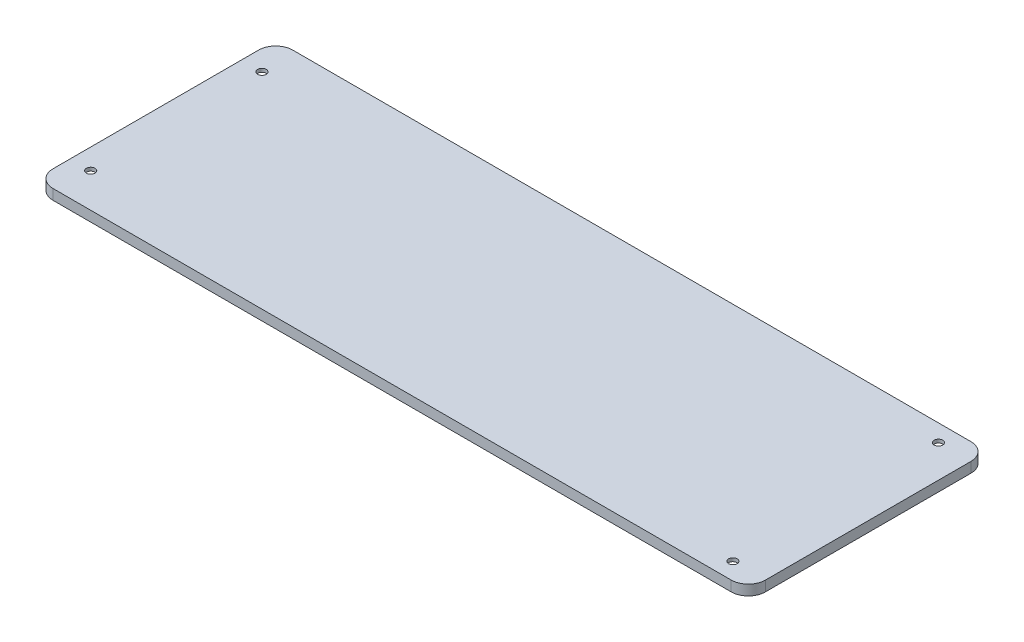
ISO-10303-21;
HEADER;
FILE_DESCRIPTION(('STEP AP214'),'2;1');
FILE_NAME('part.step','',(''),(''),'','','');
FILE_SCHEMA(('AUTOMOTIVE_DESIGN { 1 0 10303 214 1 1 1 1 }'));
ENDSEC;
DATA;
#1=APPLICATION_CONTEXT('core data for automotive mechanical design processes');
#2=APPLICATION_PROTOCOL_DEFINITION('international standard','automotive_design',2000,#1);
#3=PRODUCT_CONTEXT('',#1,'mechanical');
#4=PRODUCT('Part','Part','',(#3));
#5=PRODUCT_RELATED_PRODUCT_CATEGORY('part','',(#4));
#6=PRODUCT_DEFINITION_FORMATION('','',#4);
#7=PRODUCT_DEFINITION_CONTEXT('part definition',#1,'design');
#8=PRODUCT_DEFINITION('design','',#6,#7);
#9=PRODUCT_DEFINITION_SHAPE('','',#8);
#10=(LENGTH_UNIT() NAMED_UNIT(*) SI_UNIT(.MILLI.,.METRE.));
#11=(NAMED_UNIT(*) PLANE_ANGLE_UNIT() SI_UNIT($,.RADIAN.));
#12=(NAMED_UNIT(*) SI_UNIT($,.STERADIAN.) SOLID_ANGLE_UNIT());
#13=UNCERTAINTY_MEASURE_WITH_UNIT(LENGTH_MEASURE(1.E-05),#10,'distance_accuracy_value','');
#14=(GEOMETRIC_REPRESENTATION_CONTEXT(3) GLOBAL_UNCERTAINTY_ASSIGNED_CONTEXT((#13)) GLOBAL_UNIT_ASSIGNED_CONTEXT((#10,
#11,#12)) REPRESENTATION_CONTEXT('',''));
#15=CARTESIAN_POINT('',(0.,0.,0.));
#16=DIRECTION('',(0.,0.,1.));
#17=DIRECTION('',(1.,0.,0.));
#18=AXIS2_PLACEMENT_3D('',#15,#16,#17);
#19=CARTESIAN_POINT('',(0.,3.,0.));
#20=DIRECTION('',(0.,1.,0.));
#21=DIRECTION('',(0.,0.,1.));
#22=AXIS2_PLACEMENT_3D('',#19,#20,#21);
#23=PLANE('',#22);
#24=CARTESIAN_POINT('',(94.5,3.,-30.));
#25=DIRECTION('',(0.,1.,0.));
#26=DIRECTION('',(0.,0.,1.));
#27=AXIS2_PLACEMENT_3D('',#24,#25,#26);
#28=CIRCLE('',#27,1.25000000000001);
#29=CARTESIAN_POINT('',(94.5,3.,-28.75));
#30=VERTEX_POINT('',#29);
#31=EDGE_CURVE('E211',#30,#30,#28,.T.);
#32=ORIENTED_EDGE('',*,*,#31,.F.);
#33=EDGE_LOOP('',(#32));
#34=FACE_BOUND('',#33,.T.);
#35=CARTESIAN_POINT('',(-98.,3.,-25.));
#36=DIRECTION('',(0.,1.,0.));
#37=DIRECTION('',(0.,0.,1.));
#38=AXIS2_PLACEMENT_3D('',#35,#36,#37);
#39=CIRCLE('',#38,1.25000000000001);
#40=CARTESIAN_POINT('',(-98.,3.,-23.75));
#41=VERTEX_POINT('',#40);
#42=EDGE_CURVE('E138',#41,#41,#39,.T.);
#43=ORIENTED_EDGE('',*,*,#42,.F.);
#44=EDGE_LOOP('',(#43));
#45=FACE_BOUND('',#44,.T.);
#46=DIRECTION('',(1.,0.,0.));
#47=VECTOR('',#46,1.);
#48=CARTESIAN_POINT('',(-104.,3.,35.));
#49=LINE('',#48,#47);
#50=CARTESIAN_POINT('',(-99.,3.,35.));
#51=VERTEX_POINT('',#50);
#52=CARTESIAN_POINT('',(99.,3.,35.));
#53=VERTEX_POINT('',#52);
#54=EDGE_CURVE('E149',#51,#53,#49,.T.);
#55=ORIENTED_EDGE('',*,*,#54,.T.);
#56=CARTESIAN_POINT('',(99.,3.,30.));
#57=DIRECTION('',(0.,1.,0.));
#58=DIRECTION('',(0.,0.,1.));
#59=AXIS2_PLACEMENT_3D('',#56,#57,#58);
#60=CIRCLE('',#59,5.);
#61=CARTESIAN_POINT('',(104.,3.,30.));
#62=VERTEX_POINT('',#61);
#63=EDGE_CURVE('E179',#53,#62,#60,.T.);
#64=ORIENTED_EDGE('',*,*,#63,.T.);
#65=DIRECTION('',(0.,0.,-1.));
#66=VECTOR('',#65,1.);
#67=CARTESIAN_POINT('',(104.,3.,-35.));
#68=LINE('',#67,#66);
#69=CARTESIAN_POINT('',(104.,3.,-30.));
#70=VERTEX_POINT('',#69);
#71=EDGE_CURVE('E129',#62,#70,#68,.T.);
#72=ORIENTED_EDGE('',*,*,#71,.T.);
#73=CARTESIAN_POINT('',(99.,3.,-30.));
#74=DIRECTION('',(0.,1.,0.));
#75=DIRECTION('',(0.,0.,1.));
#76=AXIS2_PLACEMENT_3D('',#73,#74,#75);
#77=CIRCLE('',#76,5.);
#78=CARTESIAN_POINT('',(99.,3.,-35.));
#79=VERTEX_POINT('',#78);
#80=EDGE_CURVE('E176',#70,#79,#77,.T.);
#81=ORIENTED_EDGE('',*,*,#80,.T.);
#82=DIRECTION('',(-1.,0.,0.));
#83=VECTOR('',#82,1.);
#84=CARTESIAN_POINT('',(-104.,3.,-35.));
#85=LINE('',#84,#83);
#86=CARTESIAN_POINT('',(-99.,3.,-35.));
#87=VERTEX_POINT('',#86);
#88=EDGE_CURVE('E227',#79,#87,#85,.T.);
#89=ORIENTED_EDGE('',*,*,#88,.T.);
#90=CARTESIAN_POINT('',(-99.,3.,-30.));
#91=DIRECTION('',(0.,1.,0.));
#92=DIRECTION('',(0.,0.,1.));
#93=AXIS2_PLACEMENT_3D('',#90,#91,#92);
#94=CIRCLE('',#93,5.);
#95=CARTESIAN_POINT('',(-104.,3.,-30.));
#96=VERTEX_POINT('',#95);
#97=EDGE_CURVE('E63',#87,#96,#94,.T.);
#98=ORIENTED_EDGE('',*,*,#97,.T.);
#99=DIRECTION('',(0.,0.,1.));
#100=VECTOR('',#99,1.);
#101=CARTESIAN_POINT('',(-104.,3.,-35.));
#102=LINE('',#101,#100);
#103=CARTESIAN_POINT('',(-104.,3.,30.));
#104=VERTEX_POINT('',#103);
#105=EDGE_CURVE('E229',#96,#104,#102,.T.);
#106=ORIENTED_EDGE('',*,*,#105,.T.);
#107=CARTESIAN_POINT('',(-99.,3.,30.));
#108=DIRECTION('',(0.,1.,0.));
#109=DIRECTION('',(0.,0.,1.));
#110=AXIS2_PLACEMENT_3D('',#107,#108,#109);
#111=CIRCLE('',#110,5.);
#112=EDGE_CURVE('E171',#104,#51,#111,.T.);
#113=ORIENTED_EDGE('',*,*,#112,.T.);
#114=EDGE_LOOP('',(#55,#64,#72,#81,#89,#98,#106,#113));
#115=FACE_BOUND('',#114,.T.);
#116=CARTESIAN_POINT('',(-98.,3.,25.));
#117=DIRECTION('',(0.,1.,0.));
#118=DIRECTION('',(0.,0.,1.));
#119=AXIS2_PLACEMENT_3D('',#116,#117,#118);
#120=CIRCLE('',#119,1.25000000000001);
#121=CARTESIAN_POINT('',(-98.,3.,26.25));
#122=VERTEX_POINT('',#121);
#123=EDGE_CURVE('E146',#122,#122,#120,.T.);
#124=ORIENTED_EDGE('',*,*,#123,.F.);
#125=EDGE_LOOP('',(#124));
#126=FACE_BOUND('',#125,.T.);
#127=CARTESIAN_POINT('',(94.5,3.,30.));
#128=DIRECTION('',(0.,1.,0.));
#129=DIRECTION('',(0.,0.,1.));
#130=AXIS2_PLACEMENT_3D('',#127,#128,#129);
#131=CIRCLE('',#130,1.25000000000001);
#132=CARTESIAN_POINT('',(94.5,3.,31.25));
#133=VERTEX_POINT('',#132);
#134=EDGE_CURVE('E206',#133,#133,#131,.T.);
#135=ORIENTED_EDGE('',*,*,#134,.F.);
#136=EDGE_LOOP('',(#135));
#137=FACE_BOUND('',#136,.T.);
#138=ADVANCED_FACE('F39',(#34,#45,#115,#126,#137),#23,.T.);
#139=CARTESIAN_POINT('',(0.,0.,0.));
#140=DIRECTION('',(0.,1.,0.));
#141=DIRECTION('',(0.,0.,1.));
#142=AXIS2_PLACEMENT_3D('',#139,#140,#141);
#143=PLANE('',#142);
#144=CARTESIAN_POINT('',(-97.9999999999999,0.,25.));
#145=DIRECTION('',(0.,1.,0.));
#146=DIRECTION('',(0.,0.,1.));
#147=AXIS2_PLACEMENT_3D('',#144,#145,#146);
#148=CIRCLE('',#147,4.99999999999999);
#149=CARTESIAN_POINT('',(-97.9999999999999,0.,30.));
#150=VERTEX_POINT('',#149);
#151=EDGE_CURVE('E461',#150,#150,#148,.T.);
#152=ORIENTED_EDGE('',*,*,#151,.T.);
#153=EDGE_LOOP('',(#152));
#154=FACE_BOUND('',#153,.T.);
#155=CARTESIAN_POINT('',(94.5,0.,30.));
#156=DIRECTION('',(0.,1.,0.));
#157=DIRECTION('',(0.,0.,1.));
#158=AXIS2_PLACEMENT_3D('',#155,#156,#157);
#159=CIRCLE('',#158,4.75);
#160=CARTESIAN_POINT('',(94.5,0.,34.75));
#161=VERTEX_POINT('',#160);
#162=EDGE_CURVE('E469',#161,#161,#159,.T.);
#163=ORIENTED_EDGE('',*,*,#162,.T.);
#164=EDGE_LOOP('',(#163));
#165=FACE_BOUND('',#164,.T.);
#166=CARTESIAN_POINT('',(94.5000000000001,0.,-30.));
#167=DIRECTION('',(0.,1.,0.));
#168=DIRECTION('',(0.,0.,1.));
#169=AXIS2_PLACEMENT_3D('',#166,#167,#168);
#170=CIRCLE('',#169,4.75);
#171=CARTESIAN_POINT('',(94.5000000000001,0.,-25.25));
#172=VERTEX_POINT('',#171);
#173=EDGE_CURVE('E477',#172,#172,#170,.T.);
#174=ORIENTED_EDGE('',*,*,#173,.T.);
#175=EDGE_LOOP('',(#174));
#176=FACE_BOUND('',#175,.T.);
#177=CARTESIAN_POINT('',(-97.9999999999999,0.,-25.));
#178=DIRECTION('',(0.,1.,0.));
#179=DIRECTION('',(0.,0.,1.));
#180=AXIS2_PLACEMENT_3D('',#177,#178,#179);
#181=CIRCLE('',#180,4.99999999999999);
#182=CARTESIAN_POINT('',(-97.9999999999999,0.,-20.));
#183=VERTEX_POINT('',#182);
#184=EDGE_CURVE('E219',#183,#183,#181,.T.);
#185=ORIENTED_EDGE('',*,*,#184,.T.);
#186=EDGE_LOOP('',(#185));
#187=FACE_BOUND('',#186,.T.);
#188=DIRECTION('',(0.,0.,-1.));
#189=VECTOR('',#188,1.);
#190=CARTESIAN_POINT('',(104.,0.,-35.));
#191=LINE('',#190,#189);
#192=CARTESIAN_POINT('',(104.,0.,30.));
#193=VERTEX_POINT('',#192);
#194=CARTESIAN_POINT('',(104.,0.,-30.));
#195=VERTEX_POINT('',#194);
#196=EDGE_CURVE('E126',#193,#195,#191,.T.);
#197=ORIENTED_EDGE('',*,*,#196,.F.);
#198=CARTESIAN_POINT('',(99.,0.,30.));
#199=DIRECTION('',(0.,1.,0.));
#200=DIRECTION('',(0.,0.,1.));
#201=AXIS2_PLACEMENT_3D('',#198,#199,#200);
#202=CIRCLE('',#201,5.);
#203=CARTESIAN_POINT('',(99.,0.,35.));
#204=VERTEX_POINT('',#203);
#205=EDGE_CURVE('E108',#193,#204,#202,.F.);
#206=ORIENTED_EDGE('',*,*,#205,.T.);
#207=DIRECTION('',(1.,0.,0.));
#208=VECTOR('',#207,1.);
#209=CARTESIAN_POINT('',(-104.,0.,35.));
#210=LINE('',#209,#208);
#211=CARTESIAN_POINT('',(-99.,0.,35.));
#212=VERTEX_POINT('',#211);
#213=EDGE_CURVE('E154',#212,#204,#210,.T.);
#214=ORIENTED_EDGE('',*,*,#213,.F.);
#215=CARTESIAN_POINT('',(-99.,0.,30.));
#216=DIRECTION('',(0.,1.,0.));
#217=DIRECTION('',(0.,0.,1.));
#218=AXIS2_PLACEMENT_3D('',#215,#216,#217);
#219=CIRCLE('',#218,5.);
#220=CARTESIAN_POINT('',(-104.,0.,30.));
#221=VERTEX_POINT('',#220);
#222=EDGE_CURVE('E131',#212,#221,#219,.F.);
#223=ORIENTED_EDGE('',*,*,#222,.T.);
#224=DIRECTION('',(0.,0.,1.));
#225=VECTOR('',#224,1.);
#226=CARTESIAN_POINT('',(-104.,0.,-35.));
#227=LINE('',#226,#225);
#228=CARTESIAN_POINT('',(-104.,0.,-30.));
#229=VERTEX_POINT('',#228);
#230=EDGE_CURVE('E143',#229,#221,#227,.T.);
#231=ORIENTED_EDGE('',*,*,#230,.F.);
#232=CARTESIAN_POINT('',(-99.,0.,-30.));
#233=DIRECTION('',(0.,1.,0.));
#234=DIRECTION('',(0.,0.,1.));
#235=AXIS2_PLACEMENT_3D('',#232,#233,#234);
#236=CIRCLE('',#235,5.);
#237=CARTESIAN_POINT('',(-99.,0.,-35.));
#238=VERTEX_POINT('',#237);
#239=EDGE_CURVE('E161',#229,#238,#236,.F.);
#240=ORIENTED_EDGE('',*,*,#239,.T.);
#241=DIRECTION('',(-1.,0.,0.));
#242=VECTOR('',#241,1.);
#243=CARTESIAN_POINT('',(-104.,0.,-35.));
#244=LINE('',#243,#242);
#245=CARTESIAN_POINT('',(99.,0.,-35.));
#246=VERTEX_POINT('',#245);
#247=EDGE_CURVE('E137',#246,#238,#244,.T.);
#248=ORIENTED_EDGE('',*,*,#247,.F.);
#249=CARTESIAN_POINT('',(99.,0.,-30.));
#250=DIRECTION('',(0.,1.,0.));
#251=DIRECTION('',(0.,0.,1.));
#252=AXIS2_PLACEMENT_3D('',#249,#250,#251);
#253=CIRCLE('',#252,5.);
#254=EDGE_CURVE('E120',#246,#195,#253,.F.);
#255=ORIENTED_EDGE('',*,*,#254,.T.);
#256=EDGE_LOOP('',(#197,#206,#214,#223,#231,#240,#248,#255));
#257=FACE_BOUND('',#256,.T.);
#258=ADVANCED_FACE('F134',(#154,#165,#176,#187,#257),#143,.F.);
#259=CARTESIAN_POINT('',(104.,3.,-35.));
#260=DIRECTION('',(-1.,0.,0.));
#261=DIRECTION('',(0.,0.,1.));
#262=AXIS2_PLACEMENT_3D('',#259,#260,#261);
#263=PLANE('',#262);
#264=ORIENTED_EDGE('',*,*,#71,.F.);
#265=DIRECTION('',(0.,-1.,0.));
#266=VECTOR('',#265,1.);
#267=CARTESIAN_POINT('',(104.,3.,30.));
#268=LINE('',#267,#266);
#269=EDGE_CURVE('E112',#62,#193,#268,.T.);
#270=ORIENTED_EDGE('',*,*,#269,.T.);
#271=ORIENTED_EDGE('',*,*,#196,.T.);
#272=DIRECTION('',(0.,-1.,0.));
#273=VECTOR('',#272,1.);
#274=CARTESIAN_POINT('',(104.,3.,-30.));
#275=LINE('',#274,#273);
#276=EDGE_CURVE('E132',#195,#70,#275,.F.);
#277=ORIENTED_EDGE('',*,*,#276,.T.);
#278=EDGE_LOOP('',(#264,#270,#271,#277));
#279=FACE_BOUND('',#278,.T.);
#280=ADVANCED_FACE('F125',(#279),#263,.F.);
#281=CARTESIAN_POINT('',(-104.,3.,-35.));
#282=DIRECTION('',(0.,0.,1.));
#283=DIRECTION('',(1.,0.,0.));
#284=AXIS2_PLACEMENT_3D('',#281,#282,#283);
#285=PLANE('',#284);
#286=ORIENTED_EDGE('',*,*,#88,.F.);
#287=DIRECTION('',(0.,-1.,0.));
#288=VECTOR('',#287,1.);
#289=CARTESIAN_POINT('',(99.,3.,-35.));
#290=LINE('',#289,#288);
#291=EDGE_CURVE('E185',#79,#246,#290,.T.);
#292=ORIENTED_EDGE('',*,*,#291,.T.);
#293=ORIENTED_EDGE('',*,*,#247,.T.);
#294=DIRECTION('',(0.,-1.,0.));
#295=VECTOR('',#294,1.);
#296=CARTESIAN_POINT('',(-99.,3.,-35.));
#297=LINE('',#296,#295);
#298=EDGE_CURVE('E182',#238,#87,#297,.F.);
#299=ORIENTED_EDGE('',*,*,#298,.T.);
#300=EDGE_LOOP('',(#286,#292,#293,#299));
#301=FACE_BOUND('',#300,.T.);
#302=ADVANCED_FACE('F248',(#301),#285,.F.);
#303=CARTESIAN_POINT('',(-104.,3.,-35.));
#304=DIRECTION('',(1.,0.,0.));
#305=DIRECTION('',(0.,0.,-1.));
#306=AXIS2_PLACEMENT_3D('',#303,#304,#305);
#307=PLANE('',#306);
#308=ORIENTED_EDGE('',*,*,#105,.F.);
#309=DIRECTION('',(0.,-1.,0.));
#310=VECTOR('',#309,1.);
#311=CARTESIAN_POINT('',(-104.,3.,-30.));
#312=LINE('',#311,#310);
#313=EDGE_CURVE('E11',#96,#229,#312,.T.);
#314=ORIENTED_EDGE('',*,*,#313,.T.);
#315=ORIENTED_EDGE('',*,*,#230,.T.);
#316=DIRECTION('',(0.,-1.,0.));
#317=VECTOR('',#316,1.);
#318=CARTESIAN_POINT('',(-104.,3.,30.));
#319=LINE('',#318,#317);
#320=EDGE_CURVE('E49',#221,#104,#319,.F.);
#321=ORIENTED_EDGE('',*,*,#320,.T.);
#322=EDGE_LOOP('',(#308,#314,#315,#321));
#323=FACE_BOUND('',#322,.T.);
#324=ADVANCED_FACE('F241',(#323),#307,.F.);
#325=CARTESIAN_POINT('',(-104.,3.,35.));
#326=DIRECTION('',(0.,0.,-1.));
#327=DIRECTION('',(-1.,0.,0.));
#328=AXIS2_PLACEMENT_3D('',#325,#326,#327);
#329=PLANE('',#328);
#330=ORIENTED_EDGE('',*,*,#213,.T.);
#331=DIRECTION('',(0.,-1.,0.));
#332=VECTOR('',#331,1.);
#333=CARTESIAN_POINT('',(99.,3.,35.));
#334=LINE('',#333,#332);
#335=EDGE_CURVE('E113',#204,#53,#334,.F.);
#336=ORIENTED_EDGE('',*,*,#335,.T.);
#337=ORIENTED_EDGE('',*,*,#54,.F.);
#338=DIRECTION('',(0.,-1.,0.));
#339=VECTOR('',#338,1.);
#340=CARTESIAN_POINT('',(-99.,3.,35.));
#341=LINE('',#340,#339);
#342=EDGE_CURVE('E119',#51,#212,#341,.T.);
#343=ORIENTED_EDGE('',*,*,#342,.T.);
#344=EDGE_LOOP('',(#330,#336,#337,#343));
#345=FACE_BOUND('',#344,.T.);
#346=ADVANCED_FACE('F238',(#345),#329,.F.);
#347=CARTESIAN_POINT('',(-98.,3.,-25.));
#348=DIRECTION('',(0.,-1.,0.));
#349=DIRECTION('',(0.,0.,-1.));
#350=AXIS2_PLACEMENT_3D('',#347,#348,#349);
#351=CYLINDRICAL_SURFACE('',#350,1.25000000000001);
#352=CARTESIAN_POINT('',(-98.,2.,-25.));
#353=DIRECTION('',(0.,1.,0.));
#354=DIRECTION('',(0.,0.,1.));
#355=AXIS2_PLACEMENT_3D('',#352,#353,#354);
#356=CIRCLE('',#355,1.25000000000001);
#357=CARTESIAN_POINT('',(-98.,2.,-23.75));
#358=VERTEX_POINT('',#357);
#359=EDGE_CURVE('E43',#358,#358,#356,.T.);
#360=ORIENTED_EDGE('',*,*,#359,.F.);
#361=EDGE_LOOP('',(#360));
#362=FACE_BOUND('',#361,.T.);
#363=ORIENTED_EDGE('',*,*,#42,.T.);
#364=EDGE_LOOP('',(#363));
#365=FACE_BOUND('',#364,.T.);
#366=ADVANCED_FACE('F272',(#362,#365),#351,.F.);
#367=CARTESIAN_POINT('',(-98.,3.,25.));
#368=DIRECTION('',(0.,-1.,0.));
#369=DIRECTION('',(0.,0.,-1.));
#370=AXIS2_PLACEMENT_3D('',#367,#368,#369);
#371=CYLINDRICAL_SURFACE('',#370,1.25000000000001);
#372=CARTESIAN_POINT('',(-98.,2.,25.));
#373=DIRECTION('',(0.,1.,0.));
#374=DIRECTION('',(0.,0.,1.));
#375=AXIS2_PLACEMENT_3D('',#372,#373,#374);
#376=CIRCLE('',#375,1.25000000000001);
#377=CARTESIAN_POINT('',(-98.,2.,26.25));
#378=VERTEX_POINT('',#377);
#379=EDGE_CURVE('E199',#378,#378,#376,.T.);
#380=ORIENTED_EDGE('',*,*,#379,.F.);
#381=EDGE_LOOP('',(#380));
#382=FACE_BOUND('',#381,.T.);
#383=ORIENTED_EDGE('',*,*,#123,.T.);
#384=EDGE_LOOP('',(#383));
#385=FACE_BOUND('',#384,.T.);
#386=ADVANCED_FACE('F305',(#382,#385),#371,.F.);
#387=CARTESIAN_POINT('',(94.5,3.,-30.));
#388=DIRECTION('',(0.,-1.,0.));
#389=DIRECTION('',(0.,0.,-1.));
#390=AXIS2_PLACEMENT_3D('',#387,#388,#389);
#391=CYLINDRICAL_SURFACE('',#390,1.25000000000001);
#392=CARTESIAN_POINT('',(94.5,2.,-30.));
#393=DIRECTION('',(0.,1.,0.));
#394=DIRECTION('',(0.,0.,1.));
#395=AXIS2_PLACEMENT_3D('',#392,#393,#394);
#396=CIRCLE('',#395,1.25000000000001);
#397=CARTESIAN_POINT('',(94.5,2.,-28.75));
#398=VERTEX_POINT('',#397);
#399=EDGE_CURVE('E195',#398,#398,#396,.T.);
#400=ORIENTED_EDGE('',*,*,#399,.F.);
#401=EDGE_LOOP('',(#400));
#402=FACE_BOUND('',#401,.T.);
#403=ORIENTED_EDGE('',*,*,#31,.T.);
#404=EDGE_LOOP('',(#403));
#405=FACE_BOUND('',#404,.T.);
#406=ADVANCED_FACE('F312',(#402,#405),#391,.F.);
#407=CARTESIAN_POINT('',(94.5,3.,30.));
#408=DIRECTION('',(0.,-1.,0.));
#409=DIRECTION('',(0.,0.,-1.));
#410=AXIS2_PLACEMENT_3D('',#407,#408,#409);
#411=CYLINDRICAL_SURFACE('',#410,1.25000000000001);
#412=CARTESIAN_POINT('',(94.5,2.,30.));
#413=DIRECTION('',(0.,1.,0.));
#414=DIRECTION('',(0.,0.,1.));
#415=AXIS2_PLACEMENT_3D('',#412,#413,#414);
#416=CIRCLE('',#415,1.25000000000001);
#417=CARTESIAN_POINT('',(94.5,2.,31.25));
#418=VERTEX_POINT('',#417);
#419=EDGE_CURVE('E191',#418,#418,#416,.T.);
#420=ORIENTED_EDGE('',*,*,#419,.F.);
#421=EDGE_LOOP('',(#420));
#422=FACE_BOUND('',#421,.T.);
#423=ORIENTED_EDGE('',*,*,#134,.T.);
#424=EDGE_LOOP('',(#423));
#425=FACE_BOUND('',#424,.T.);
#426=ADVANCED_FACE('F259',(#422,#425),#411,.F.);
#427=CARTESIAN_POINT('',(99.,3.,30.));
#428=DIRECTION('',(0.,-1.,0.));
#429=DIRECTION('',(0.,0.,-1.));
#430=AXIS2_PLACEMENT_3D('',#427,#428,#429);
#431=CYLINDRICAL_SURFACE('',#430,5.);
#432=ORIENTED_EDGE('',*,*,#63,.F.);
#433=ORIENTED_EDGE('',*,*,#335,.F.);
#434=ORIENTED_EDGE('',*,*,#205,.F.);
#435=ORIENTED_EDGE('',*,*,#269,.F.);
#436=EDGE_LOOP('',(#432,#433,#434,#435));
#437=FACE_BOUND('',#436,.T.);
#438=ADVANCED_FACE('F111',(#437),#431,.T.);
#439=CARTESIAN_POINT('',(99.,3.,-30.));
#440=DIRECTION('',(0.,-1.,0.));
#441=DIRECTION('',(0.,0.,-1.));
#442=AXIS2_PLACEMENT_3D('',#439,#440,#441);
#443=CYLINDRICAL_SURFACE('',#442,5.);
#444=ORIENTED_EDGE('',*,*,#80,.F.);
#445=ORIENTED_EDGE('',*,*,#276,.F.);
#446=ORIENTED_EDGE('',*,*,#254,.F.);
#447=ORIENTED_EDGE('',*,*,#291,.F.);
#448=EDGE_LOOP('',(#444,#445,#446,#447));
#449=FACE_BOUND('',#448,.T.);
#450=ADVANCED_FACE('F252',(#449),#443,.T.);
#451=CARTESIAN_POINT('',(-99.,3.,-30.));
#452=DIRECTION('',(0.,-1.,0.));
#453=DIRECTION('',(0.,0.,-1.));
#454=AXIS2_PLACEMENT_3D('',#451,#452,#453);
#455=CYLINDRICAL_SURFACE('',#454,5.);
#456=ORIENTED_EDGE('',*,*,#97,.F.);
#457=ORIENTED_EDGE('',*,*,#298,.F.);
#458=ORIENTED_EDGE('',*,*,#239,.F.);
#459=ORIENTED_EDGE('',*,*,#313,.F.);
#460=EDGE_LOOP('',(#456,#457,#458,#459));
#461=FACE_BOUND('',#460,.T.);
#462=ADVANCED_FACE('F244',(#461),#455,.T.);
#463=CARTESIAN_POINT('',(-99.,3.,30.));
#464=DIRECTION('',(0.,-1.,0.));
#465=DIRECTION('',(0.,0.,-1.));
#466=AXIS2_PLACEMENT_3D('',#463,#464,#465);
#467=CYLINDRICAL_SURFACE('',#466,5.);
#468=ORIENTED_EDGE('',*,*,#112,.F.);
#469=ORIENTED_EDGE('',*,*,#320,.F.);
#470=ORIENTED_EDGE('',*,*,#222,.F.);
#471=ORIENTED_EDGE('',*,*,#342,.F.);
#472=EDGE_LOOP('',(#468,#469,#470,#471));
#473=FACE_BOUND('',#472,.T.);
#474=ADVANCED_FACE('F41',(#473),#467,.T.);
#475=CARTESIAN_POINT('',(94.5,2.,30.));
#476=DIRECTION('',(0.,-1.,0.));
#477=DIRECTION('',(0.,0.,-1.));
#478=AXIS2_PLACEMENT_3D('',#475,#476,#477);
#479=CYLINDRICAL_SURFACE('',#478,4.75);
#480=CARTESIAN_POINT('',(94.5,2.,30.));
#481=DIRECTION('',(0.,1.,0.));
#482=DIRECTION('',(0.,0.,1.));
#483=AXIS2_PLACEMENT_3D('',#480,#481,#482);
#484=CIRCLE('',#483,4.75);
#485=CARTESIAN_POINT('',(94.5,2.,34.75));
#486=VERTEX_POINT('',#485);
#487=EDGE_CURVE('E473',#486,#486,#484,.T.);
#488=ORIENTED_EDGE('',*,*,#487,.T.);
#489=EDGE_LOOP('',(#488));
#490=FACE_BOUND('',#489,.T.);
#491=ORIENTED_EDGE('',*,*,#162,.F.);
#492=EDGE_LOOP('',(#491));
#493=FACE_BOUND('',#492,.T.);
#494=ADVANCED_FACE('F349',(#490,#493),#479,.F.);
#495=CARTESIAN_POINT('',(94.5,2.,30.));
#496=DIRECTION('',(0.,1.,0.));
#497=DIRECTION('',(0.,0.,1.));
#498=AXIS2_PLACEMENT_3D('',#495,#496,#497);
#499=PLANE('',#498);
#500=ORIENTED_EDGE('',*,*,#419,.T.);
#501=EDGE_LOOP('',(#500));
#502=FACE_BOUND('',#501,.T.);
#503=ORIENTED_EDGE('',*,*,#487,.F.);
#504=EDGE_LOOP('',(#503));
#505=FACE_BOUND('',#504,.T.);
#506=ADVANCED_FACE('F381',(#502,#505),#499,.F.);
#507=CARTESIAN_POINT('',(94.5000000000001,2.,-30.));
#508=DIRECTION('',(0.,-1.,0.));
#509=DIRECTION('',(0.,0.,-1.));
#510=AXIS2_PLACEMENT_3D('',#507,#508,#509);
#511=CYLINDRICAL_SURFACE('',#510,4.75);
#512=CARTESIAN_POINT('',(94.5000000000001,2.,-30.));
#513=DIRECTION('',(0.,1.,0.));
#514=DIRECTION('',(0.,0.,1.));
#515=AXIS2_PLACEMENT_3D('',#512,#513,#514);
#516=CIRCLE('',#515,4.75);
#517=CARTESIAN_POINT('',(94.5000000000001,2.,-25.25));
#518=VERTEX_POINT('',#517);
#519=EDGE_CURVE('E459',#518,#518,#516,.T.);
#520=ORIENTED_EDGE('',*,*,#519,.T.);
#521=EDGE_LOOP('',(#520));
#522=FACE_BOUND('',#521,.T.);
#523=ORIENTED_EDGE('',*,*,#173,.F.);
#524=EDGE_LOOP('',(#523));
#525=FACE_BOUND('',#524,.T.);
#526=ADVANCED_FACE('F388',(#522,#525),#511,.F.);
#527=CARTESIAN_POINT('',(94.5000000000001,2.,-30.));
#528=DIRECTION('',(0.,1.,0.));
#529=DIRECTION('',(0.,0.,1.));
#530=AXIS2_PLACEMENT_3D('',#527,#528,#529);
#531=PLANE('',#530);
#532=ORIENTED_EDGE('',*,*,#399,.T.);
#533=EDGE_LOOP('',(#532));
#534=FACE_BOUND('',#533,.T.);
#535=ORIENTED_EDGE('',*,*,#519,.F.);
#536=EDGE_LOOP('',(#535));
#537=FACE_BOUND('',#536,.T.);
#538=ADVANCED_FACE('F396',(#534,#537),#531,.F.);
#539=CARTESIAN_POINT('',(-97.9999999999999,2.,25.));
#540=DIRECTION('',(0.,-1.,0.));
#541=DIRECTION('',(0.,0.,-1.));
#542=AXIS2_PLACEMENT_3D('',#539,#540,#541);
#543=CYLINDRICAL_SURFACE('',#542,4.99999999999999);
#544=CARTESIAN_POINT('',(-97.9999999999999,2.,25.));
#545=DIRECTION('',(0.,1.,0.));
#546=DIRECTION('',(0.,0.,1.));
#547=AXIS2_PLACEMENT_3D('',#544,#545,#546);
#548=CIRCLE('',#547,4.99999999999999);
#549=CARTESIAN_POINT('',(-97.9999999999999,2.,30.));
#550=VERTEX_POINT('',#549);
#551=EDGE_CURVE('E465',#550,#550,#548,.T.);
#552=ORIENTED_EDGE('',*,*,#551,.T.);
#553=EDGE_LOOP('',(#552));
#554=FACE_BOUND('',#553,.T.);
#555=ORIENTED_EDGE('',*,*,#151,.F.);
#556=EDGE_LOOP('',(#555));
#557=FACE_BOUND('',#556,.T.);
#558=ADVANCED_FACE('F404',(#554,#557),#543,.F.);
#559=CARTESIAN_POINT('',(-97.9999999999999,2.,25.));
#560=DIRECTION('',(0.,1.,0.));
#561=DIRECTION('',(0.,0.,1.));
#562=AXIS2_PLACEMENT_3D('',#559,#560,#561);
#563=PLANE('',#562);
#564=ORIENTED_EDGE('',*,*,#379,.T.);
#565=EDGE_LOOP('',(#564));
#566=FACE_BOUND('',#565,.T.);
#567=ORIENTED_EDGE('',*,*,#551,.F.);
#568=EDGE_LOOP('',(#567));
#569=FACE_BOUND('',#568,.T.);
#570=ADVANCED_FACE('F412',(#566,#569),#563,.F.);
#571=CARTESIAN_POINT('',(-97.9999999999999,2.,-25.));
#572=DIRECTION('',(0.,-1.,0.));
#573=DIRECTION('',(0.,0.,-1.));
#574=AXIS2_PLACEMENT_3D('',#571,#572,#573);
#575=CYLINDRICAL_SURFACE('',#574,4.99999999999999);
#576=CARTESIAN_POINT('',(-97.9999999999999,2.,-25.));
#577=DIRECTION('',(0.,1.,0.));
#578=DIRECTION('',(0.,0.,1.));
#579=AXIS2_PLACEMENT_3D('',#576,#577,#578);
#580=CIRCLE('',#579,4.99999999999999);
#581=CARTESIAN_POINT('',(-97.9999999999999,2.,-20.));
#582=VERTEX_POINT('',#581);
#583=EDGE_CURVE('E196',#582,#582,#580,.T.);
#584=ORIENTED_EDGE('',*,*,#583,.T.);
#585=EDGE_LOOP('',(#584));
#586=FACE_BOUND('',#585,.T.);
#587=ORIENTED_EDGE('',*,*,#184,.F.);
#588=EDGE_LOOP('',(#587));
#589=FACE_BOUND('',#588,.T.);
#590=ADVANCED_FACE('F420',(#586,#589),#575,.F.);
#591=CARTESIAN_POINT('',(-97.9999999999999,2.,-25.));
#592=DIRECTION('',(0.,1.,0.));
#593=DIRECTION('',(0.,0.,1.));
#594=AXIS2_PLACEMENT_3D('',#591,#592,#593);
#595=PLANE('',#594);
#596=ORIENTED_EDGE('',*,*,#359,.T.);
#597=EDGE_LOOP('',(#596));
#598=FACE_BOUND('',#597,.T.);
#599=ORIENTED_EDGE('',*,*,#583,.F.);
#600=EDGE_LOOP('',(#599));
#601=FACE_BOUND('',#600,.T.);
#602=ADVANCED_FACE('F427',(#598,#601),#595,.F.);
#603=CLOSED_SHELL('',(#138,#258,#280,#302,#324,#346,#366,#386,#406,#426,#438,#450,#462,#474,
#494,#506,#526,#538,#558,#570,#590,#602));
#604=MANIFOLD_SOLID_BREP('B2',#603);
#605=ADVANCED_BREP_SHAPE_REPRESENTATION('',(#18,#604),#14);
#606=SHAPE_DEFINITION_REPRESENTATION(#9,#605);
ENDSEC;
END-ISO-10303-21;
